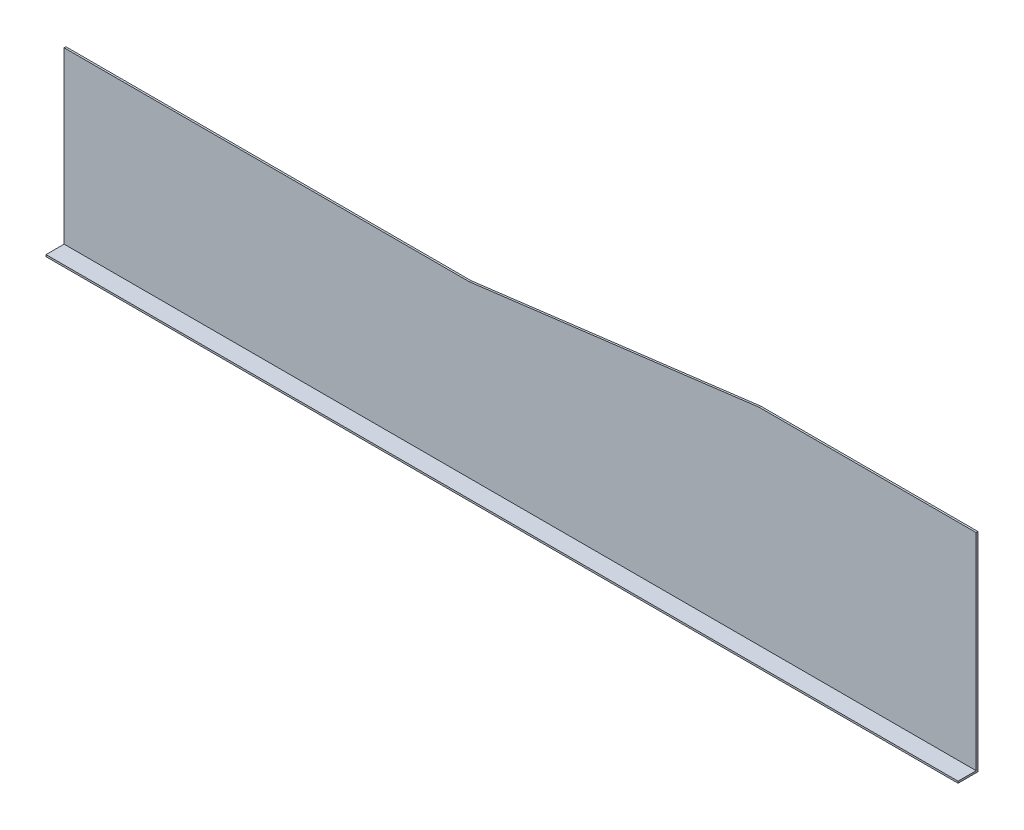
ISO-10303-21;
HEADER;
FILE_DESCRIPTION(('STEP AP214'),'2;1');
FILE_NAME('part.step','',(''),(''),'','','');
FILE_SCHEMA(('AUTOMOTIVE_DESIGN { 1 0 10303 214 1 1 1 1 }'));
ENDSEC;
DATA;
#1=APPLICATION_CONTEXT('core data for automotive mechanical design processes');
#2=APPLICATION_PROTOCOL_DEFINITION('international standard','automotive_design',2000,#1);
#3=PRODUCT_CONTEXT('',#1,'mechanical');
#4=PRODUCT('Part','Part','',(#3));
#5=PRODUCT_RELATED_PRODUCT_CATEGORY('part','',(#4));
#6=PRODUCT_DEFINITION_FORMATION('','',#4);
#7=PRODUCT_DEFINITION_CONTEXT('part definition',#1,'design');
#8=PRODUCT_DEFINITION('design','',#6,#7);
#9=PRODUCT_DEFINITION_SHAPE('','',#8);
#10=(LENGTH_UNIT() NAMED_UNIT(*) SI_UNIT(.MILLI.,.METRE.));
#11=(NAMED_UNIT(*) PLANE_ANGLE_UNIT() SI_UNIT($,.RADIAN.));
#12=(NAMED_UNIT(*) SI_UNIT($,.STERADIAN.) SOLID_ANGLE_UNIT());
#13=UNCERTAINTY_MEASURE_WITH_UNIT(LENGTH_MEASURE(1.E-05),#10,'distance_accuracy_value','');
#14=(GEOMETRIC_REPRESENTATION_CONTEXT(3) GLOBAL_UNCERTAINTY_ASSIGNED_CONTEXT((#13)) GLOBAL_UNIT_ASSIGNED_CONTEXT((#10,
#11,#12)) REPRESENTATION_CONTEXT('',''));
#15=CARTESIAN_POINT('',(0.,0.,0.));
#16=DIRECTION('',(0.,0.,1.));
#17=DIRECTION('',(1.,0.,0.));
#18=AXIS2_PLACEMENT_3D('',#15,#16,#17);
#19=CARTESIAN_POINT('',(0.,0.,1.27));
#20=DIRECTION('',(0.,0.,-1.));
#21=DIRECTION('',(-1.,0.,0.));
#22=AXIS2_PLACEMENT_3D('',#19,#20,#21);
#23=PLANE('',#22);
#24=DIRECTION('',(-1.,0.,0.));
#25=VECTOR('',#24,1.);
#26=CARTESIAN_POINT('',(0.,1.27,1.27));
#27=LINE('',#26,#25);
#28=CARTESIAN_POINT('',(630.,1.26999999999999,1.27));
#29=VERTEX_POINT('',#28);
#30=CARTESIAN_POINT('',(0.,1.27,1.27));
#31=VERTEX_POINT('',#30);
#32=EDGE_CURVE('E54',#29,#31,#27,.T.);
#33=ORIENTED_EDGE('',*,*,#32,.F.);
#34=DIRECTION('',(0.,1.,0.));
#35=VECTOR('',#34,1.);
#36=CARTESIAN_POINT('',(630.,143.73,1.27));
#37=LINE('',#36,#35);
#38=CARTESIAN_POINT('',(630.,143.73,1.27));
#39=VERTEX_POINT('',#38);
#40=EDGE_CURVE('E93',#29,#39,#37,.T.);
#41=ORIENTED_EDGE('',*,*,#40,.T.);
#42=DIRECTION('',(-1.,0.,0.));
#43=VECTOR('',#42,1.);
#44=CARTESIAN_POINT('',(480.,143.73,1.27));
#45=LINE('',#44,#43);
#46=CARTESIAN_POINT('',(480.,143.73,1.27));
#47=VERTEX_POINT('',#46);
#48=EDGE_CURVE('E142',#39,#47,#45,.T.);
#49=ORIENTED_EDGE('',*,*,#48,.T.);
#50=DIRECTION('',(-0.992277876713668,-0.124034734589208,0.));
#51=VECTOR('',#50,1.);
#52=CARTESIAN_POINT('',(280.,118.73,1.27));
#53=LINE('',#52,#51);
#54=CARTESIAN_POINT('',(280.,118.73,1.27));
#55=VERTEX_POINT('',#54);
#56=EDGE_CURVE('E144',#47,#55,#53,.T.);
#57=ORIENTED_EDGE('',*,*,#56,.T.);
#58=DIRECTION('',(-1.,0.,0.));
#59=VECTOR('',#58,1.);
#60=CARTESIAN_POINT('',(0.,118.73,1.27));
#61=LINE('',#60,#59);
#62=CARTESIAN_POINT('',(0.,118.73,1.27));
#63=VERTEX_POINT('',#62);
#64=EDGE_CURVE('E61',#55,#63,#61,.T.);
#65=ORIENTED_EDGE('',*,*,#64,.T.);
#66=DIRECTION('',(0.,-1.,0.));
#67=VECTOR('',#66,1.);
#68=CARTESIAN_POINT('',(0.,0.,1.27));
#69=LINE('',#68,#67);
#70=EDGE_CURVE('E118',#63,#31,#69,.T.);
#71=ORIENTED_EDGE('',*,*,#70,.T.);
#72=EDGE_LOOP('',(#33,#41,#49,#57,#65,#71));
#73=FACE_BOUND('',#72,.T.);
#74=ADVANCED_FACE('F39',(#73),#23,.F.);
#75=CARTESIAN_POINT('',(630.,0.,1.27));
#76=DIRECTION('',(0.,1.,0.));
#77=DIRECTION('',(-1.,0.,0.));
#78=AXIS2_PLACEMENT_3D('',#75,#76,#77);
#79=PLANE('',#78);
#80=DIRECTION('',(1.,0.,0.));
#81=VECTOR('',#80,1.);
#82=CARTESIAN_POINT('',(630.,0.,0.));
#83=LINE('',#82,#81);
#84=CARTESIAN_POINT('',(0.,0.,0.));
#85=VERTEX_POINT('',#84);
#86=CARTESIAN_POINT('',(630.,0.,0.));
#87=VERTEX_POINT('',#86);
#88=EDGE_CURVE('E140',#85,#87,#83,.T.);
#89=ORIENTED_EDGE('',*,*,#88,.T.);
#90=DIRECTION('',(0.,0.,-1.));
#91=VECTOR('',#90,1.);
#92=CARTESIAN_POINT('',(630.,0.,1.27));
#93=LINE('',#92,#91);
#94=CARTESIAN_POINT('',(630.,0.,13.77));
#95=VERTEX_POINT('',#94);
#96=EDGE_CURVE('E11',#95,#87,#93,.T.);
#97=ORIENTED_EDGE('',*,*,#96,.F.);
#98=DIRECTION('',(1.,0.,0.));
#99=VECTOR('',#98,1.);
#100=CARTESIAN_POINT('',(0.,0.,13.77));
#101=LINE('',#100,#99);
#102=CARTESIAN_POINT('',(0.,0.,13.77));
#103=VERTEX_POINT('',#102);
#104=EDGE_CURVE('E121',#103,#95,#101,.T.);
#105=ORIENTED_EDGE('',*,*,#104,.F.);
#106=DIRECTION('',(0.,0.,-1.));
#107=VECTOR('',#106,1.);
#108=CARTESIAN_POINT('',(0.,0.,1.27));
#109=LINE('',#108,#107);
#110=EDGE_CURVE('E108',#103,#85,#109,.T.);
#111=ORIENTED_EDGE('',*,*,#110,.T.);
#112=EDGE_LOOP('',(#89,#97,#105,#111));
#113=FACE_BOUND('',#112,.T.);
#114=ADVANCED_FACE('F41',(#113),#79,.F.);
#115=CARTESIAN_POINT('',(630.,143.73,1.27));
#116=DIRECTION('',(-1.,0.,0.));
#117=DIRECTION('',(0.,0.,1.));
#118=AXIS2_PLACEMENT_3D('',#115,#116,#117);
#119=PLANE('',#118);
#120=DIRECTION('',(0.,1.,0.));
#121=VECTOR('',#120,1.);
#122=CARTESIAN_POINT('',(630.,143.73,0.));
#123=LINE('',#122,#121);
#124=CARTESIAN_POINT('',(630.,143.73,0.));
#125=VERTEX_POINT('',#124);
#126=EDGE_CURVE('E149',#87,#125,#123,.T.);
#127=ORIENTED_EDGE('',*,*,#126,.T.);
#128=DIRECTION('',(0.,0.,-1.));
#129=VECTOR('',#128,1.);
#130=CARTESIAN_POINT('',(630.,143.73,1.27));
#131=LINE('',#130,#129);
#132=EDGE_CURVE('E47',#39,#125,#131,.T.);
#133=ORIENTED_EDGE('',*,*,#132,.F.);
#134=ORIENTED_EDGE('',*,*,#40,.F.);
#135=DIRECTION('',(0.,0.,-1.));
#136=VECTOR('',#135,1.);
#137=CARTESIAN_POINT('',(630.,1.27,13.77));
#138=LINE('',#137,#136);
#139=CARTESIAN_POINT('',(630.,1.27,13.77));
#140=VERTEX_POINT('',#139);
#141=EDGE_CURVE('E137',#140,#29,#138,.T.);
#142=ORIENTED_EDGE('',*,*,#141,.F.);
#143=DIRECTION('',(0.,1.,0.));
#144=VECTOR('',#143,1.);
#145=CARTESIAN_POINT('',(630.,0.,13.77));
#146=LINE('',#145,#144);
#147=EDGE_CURVE('E124',#95,#140,#146,.T.);
#148=ORIENTED_EDGE('',*,*,#147,.F.);
#149=ORIENTED_EDGE('',*,*,#96,.T.);
#150=EDGE_LOOP('',(#127,#133,#134,#142,#148,#149));
#151=FACE_BOUND('',#150,.T.);
#152=ADVANCED_FACE('F185',(#151),#119,.F.);
#153=CARTESIAN_POINT('',(480.,143.73,1.27));
#154=DIRECTION('',(0.,-1.,0.));
#155=DIRECTION('',(1.,0.,0.));
#156=AXIS2_PLACEMENT_3D('',#153,#154,#155);
#157=PLANE('',#156);
#158=DIRECTION('',(-1.,0.,0.));
#159=VECTOR('',#158,1.);
#160=CARTESIAN_POINT('',(480.,143.73,0.));
#161=LINE('',#160,#159);
#162=CARTESIAN_POINT('',(480.,143.73,0.));
#163=VERTEX_POINT('',#162);
#164=EDGE_CURVE('E151',#125,#163,#161,.T.);
#165=ORIENTED_EDGE('',*,*,#164,.T.);
#166=DIRECTION('',(0.,0.,-1.));
#167=VECTOR('',#166,1.);
#168=CARTESIAN_POINT('',(480.,143.73,1.27));
#169=LINE('',#168,#167);
#170=EDGE_CURVE('E162',#47,#163,#169,.T.);
#171=ORIENTED_EDGE('',*,*,#170,.F.);
#172=ORIENTED_EDGE('',*,*,#48,.F.);
#173=ORIENTED_EDGE('',*,*,#132,.T.);
#174=EDGE_LOOP('',(#165,#171,#172,#173));
#175=FACE_BOUND('',#174,.T.);
#176=ADVANCED_FACE('F168',(#175),#157,.F.);
#177=CARTESIAN_POINT('',(280.,118.73,1.27));
#178=DIRECTION('',(0.124034734589208,-0.992277876713668,0.));
#179=DIRECTION('',(0.992277876713668,0.124034734589208,0.));
#180=AXIS2_PLACEMENT_3D('',#177,#178,#179);
#181=PLANE('',#180);
#182=DIRECTION('',(-0.992277876713668,-0.124034734589208,0.));
#183=VECTOR('',#182,1.);
#184=CARTESIAN_POINT('',(280.,118.73,0.));
#185=LINE('',#184,#183);
#186=CARTESIAN_POINT('',(280.,118.73,0.));
#187=VERTEX_POINT('',#186);
#188=EDGE_CURVE('E153',#163,#187,#185,.T.);
#189=ORIENTED_EDGE('',*,*,#188,.T.);
#190=DIRECTION('',(0.,0.,-1.));
#191=VECTOR('',#190,1.);
#192=CARTESIAN_POINT('',(280.,118.73,1.27));
#193=LINE('',#192,#191);
#194=EDGE_CURVE('E159',#55,#187,#193,.T.);
#195=ORIENTED_EDGE('',*,*,#194,.F.);
#196=ORIENTED_EDGE('',*,*,#56,.F.);
#197=ORIENTED_EDGE('',*,*,#170,.T.);
#198=EDGE_LOOP('',(#189,#195,#196,#197));
#199=FACE_BOUND('',#198,.T.);
#200=ADVANCED_FACE('F177',(#199),#181,.F.);
#201=CARTESIAN_POINT('',(0.,118.73,1.27));
#202=DIRECTION('',(0.,-1.,0.));
#203=DIRECTION('',(0.,0.,-1.));
#204=AXIS2_PLACEMENT_3D('',#201,#202,#203);
#205=PLANE('',#204);
#206=DIRECTION('',(-1.,0.,0.));
#207=VECTOR('',#206,1.);
#208=CARTESIAN_POINT('',(0.,118.73,0.));
#209=LINE('',#208,#207);
#210=CARTESIAN_POINT('',(0.,118.73,0.));
#211=VERTEX_POINT('',#210);
#212=EDGE_CURVE('E155',#187,#211,#209,.T.);
#213=ORIENTED_EDGE('',*,*,#212,.T.);
#214=DIRECTION('',(0.,0.,-1.));
#215=VECTOR('',#214,1.);
#216=CARTESIAN_POINT('',(0.,118.73,1.27));
#217=LINE('',#216,#215);
#218=EDGE_CURVE('E117',#63,#211,#217,.T.);
#219=ORIENTED_EDGE('',*,*,#218,.F.);
#220=ORIENTED_EDGE('',*,*,#64,.F.);
#221=ORIENTED_EDGE('',*,*,#194,.T.);
#222=EDGE_LOOP('',(#213,#219,#220,#221));
#223=FACE_BOUND('',#222,.T.);
#224=ADVANCED_FACE('F180',(#223),#205,.F.);
#225=CARTESIAN_POINT('',(0.,0.,1.27));
#226=DIRECTION('',(1.,0.,0.));
#227=DIRECTION('',(0.,0.,-1.));
#228=AXIS2_PLACEMENT_3D('',#225,#226,#227);
#229=PLANE('',#228);
#230=DIRECTION('',(0.,-1.,0.));
#231=VECTOR('',#230,1.);
#232=CARTESIAN_POINT('',(0.,0.,0.));
#233=LINE('',#232,#231);
#234=EDGE_CURVE('E89',#211,#85,#233,.T.);
#235=ORIENTED_EDGE('',*,*,#234,.T.);
#236=ORIENTED_EDGE('',*,*,#110,.F.);
#237=DIRECTION('',(0.,-1.,0.));
#238=VECTOR('',#237,1.);
#239=CARTESIAN_POINT('',(0.,0.,13.77));
#240=LINE('',#239,#238);
#241=CARTESIAN_POINT('',(0.,1.27,13.77));
#242=VERTEX_POINT('',#241);
#243=EDGE_CURVE('E113',#242,#103,#240,.T.);
#244=ORIENTED_EDGE('',*,*,#243,.F.);
#245=DIRECTION('',(0.,0.,-1.));
#246=VECTOR('',#245,1.);
#247=CARTESIAN_POINT('',(0.,1.27,13.77));
#248=LINE('',#247,#246);
#249=EDGE_CURVE('E134',#242,#31,#248,.T.);
#250=ORIENTED_EDGE('',*,*,#249,.T.);
#251=ORIENTED_EDGE('',*,*,#70,.F.);
#252=ORIENTED_EDGE('',*,*,#218,.T.);
#253=EDGE_LOOP('',(#235,#236,#244,#250,#251,#252));
#254=FACE_BOUND('',#253,.T.);
#255=ADVANCED_FACE('F110',(#254),#229,.F.);
#256=CARTESIAN_POINT('',(0.,0.,0.));
#257=DIRECTION('',(0.,0.,-1.));
#258=DIRECTION('',(-1.,0.,0.));
#259=AXIS2_PLACEMENT_3D('',#256,#257,#258);
#260=PLANE('',#259);
#261=ORIENTED_EDGE('',*,*,#88,.F.);
#262=ORIENTED_EDGE('',*,*,#234,.F.);
#263=ORIENTED_EDGE('',*,*,#212,.F.);
#264=ORIENTED_EDGE('',*,*,#188,.F.);
#265=ORIENTED_EDGE('',*,*,#164,.F.);
#266=ORIENTED_EDGE('',*,*,#126,.F.);
#267=EDGE_LOOP('',(#261,#262,#263,#264,#265,#266));
#268=FACE_BOUND('',#267,.T.);
#269=ADVANCED_FACE('F173',(#268),#260,.T.);
#270=CARTESIAN_POINT('',(0.,1.27,13.77));
#271=DIRECTION('',(0.,-1.,0.));
#272=DIRECTION('',(0.,0.,-1.));
#273=AXIS2_PLACEMENT_3D('',#270,#271,#272);
#274=PLANE('',#273);
#275=ORIENTED_EDGE('',*,*,#32,.T.);
#276=ORIENTED_EDGE('',*,*,#249,.F.);
#277=DIRECTION('',(-1.,0.,0.));
#278=VECTOR('',#277,1.);
#279=CARTESIAN_POINT('',(0.,1.27,13.77));
#280=LINE('',#279,#278);
#281=EDGE_CURVE('E128',#140,#242,#280,.T.);
#282=ORIENTED_EDGE('',*,*,#281,.F.);
#283=ORIENTED_EDGE('',*,*,#141,.T.);
#284=EDGE_LOOP('',(#275,#276,#282,#283));
#285=FACE_BOUND('',#284,.T.);
#286=ADVANCED_FACE('F183',(#285),#274,.F.);
#287=CARTESIAN_POINT('',(0.,0.,13.77));
#288=DIRECTION('',(0.,0.,-1.));
#289=DIRECTION('',(-1.,0.,0.));
#290=AXIS2_PLACEMENT_3D('',#287,#288,#289);
#291=PLANE('',#290);
#292=ORIENTED_EDGE('',*,*,#243,.T.);
#293=ORIENTED_EDGE('',*,*,#104,.T.);
#294=ORIENTED_EDGE('',*,*,#147,.T.);
#295=ORIENTED_EDGE('',*,*,#281,.T.);
#296=EDGE_LOOP('',(#292,#293,#294,#295));
#297=FACE_BOUND('',#296,.T.);
#298=ADVANCED_FACE('F126',(#297),#291,.F.);
#299=CLOSED_SHELL('',(#74,#114,#152,#176,#200,#224,#255,#269,#286,#298));
#300=MANIFOLD_SOLID_BREP('B2',#299);
#301=ADVANCED_BREP_SHAPE_REPRESENTATION('',(#18,#300),#14);
#302=SHAPE_DEFINITION_REPRESENTATION(#9,#301);
ENDSEC;
END-ISO-10303-21;
